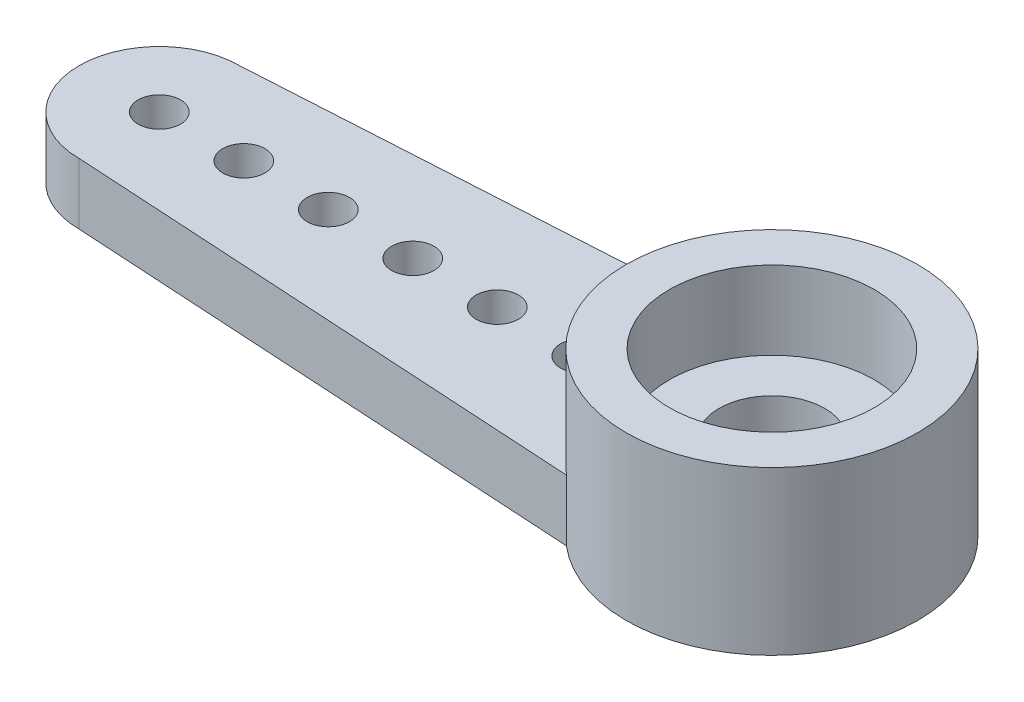
ISO-10303-21;
HEADER;
FILE_DESCRIPTION(('STEP AP214'),'2;1');
FILE_NAME('part.step','',(''),(''),'','','');
FILE_SCHEMA(('AUTOMOTIVE_DESIGN { 1 0 10303 214 1 1 1 1 }'));
ENDSEC;
DATA;
#1=APPLICATION_CONTEXT('core data for automotive mechanical design processes');
#2=APPLICATION_PROTOCOL_DEFINITION('international standard','automotive_design',2000,#1);
#3=PRODUCT_CONTEXT('',#1,'mechanical');
#4=PRODUCT('Part','Part','',(#3));
#5=PRODUCT_RELATED_PRODUCT_CATEGORY('part','',(#4));
#6=PRODUCT_DEFINITION_FORMATION('','',#4);
#7=PRODUCT_DEFINITION_CONTEXT('part definition',#1,'design');
#8=PRODUCT_DEFINITION('design','',#6,#7);
#9=PRODUCT_DEFINITION_SHAPE('','',#8);
#10=(LENGTH_UNIT() NAMED_UNIT(*) SI_UNIT(.MILLI.,.METRE.));
#11=(NAMED_UNIT(*) PLANE_ANGLE_UNIT() SI_UNIT($,.RADIAN.));
#12=(NAMED_UNIT(*) SI_UNIT($,.STERADIAN.) SOLID_ANGLE_UNIT());
#13=UNCERTAINTY_MEASURE_WITH_UNIT(LENGTH_MEASURE(1.E-05),#10,'distance_accuracy_value','');
#14=(GEOMETRIC_REPRESENTATION_CONTEXT(3) GLOBAL_UNCERTAINTY_ASSIGNED_CONTEXT((#13)) GLOBAL_UNIT_ASSIGNED_CONTEXT((#10,
#11,#12)) REPRESENTATION_CONTEXT('',''));
#15=CARTESIAN_POINT('',(0.,0.,0.));
#16=DIRECTION('',(0.,0.,1.));
#17=DIRECTION('',(1.,0.,0.));
#18=AXIS2_PLACEMENT_3D('',#15,#16,#17);
#19=CARTESIAN_POINT('',(0.,3.85,0.));
#20=DIRECTION('',(0.,-1.,0.));
#21=DIRECTION('',(0.,0.,-1.));
#22=AXIS2_PLACEMENT_3D('',#19,#20,#21);
#23=CYLINDRICAL_SURFACE('',#22,2.425);
#24=CARTESIAN_POINT('',(0.,3.85,0.));
#25=DIRECTION('',(0.,1.,0.));
#26=DIRECTION('',(0.,0.,1.));
#27=AXIS2_PLACEMENT_3D('',#24,#25,#26);
#28=CIRCLE('',#27,2.425);
#29=CARTESIAN_POINT('',(0.,3.85,-2.425));
#30=VERTEX_POINT('',#29);
#31=EDGE_CURVE('E124',#30,#30,#28,.T.);
#32=CARTESIAN_POINT('',(0.,2.,0.));
#33=DIRECTION('',(0.,-1.,0.));
#34=DIRECTION('',(0.,0.,-1.));
#35=AXIS2_PLACEMENT_3D('',#32,#33,#34);
#36=CIRCLE('',#35,2.425);
#37=CARTESIAN_POINT('',(0.,2.,-2.425));
#38=VERTEX_POINT('',#37);
#39=EDGE_CURVE('E118',#38,#38,#36,.T.);
#40=CARTESIAN_POINT('',(0.,3.85,-2.425));
#41=CARTESIAN_POINT('',(0.,3.83072916666667,-2.425));
#42=CARTESIAN_POINT('',(0.,3.81145833333333,-2.425));
#43=CARTESIAN_POINT('',(0.,3.77291666666667,-2.425));
#44=CARTESIAN_POINT('',(0.,3.75364583333333,-2.425));
#45=CARTESIAN_POINT('',(0.,3.71510416666667,-2.425));
#46=CARTESIAN_POINT('',(0.,3.69583333333333,-2.425));
#47=CARTESIAN_POINT('',(0.,3.65729166666667,-2.425));
#48=CARTESIAN_POINT('',(0.,3.63802083333333,-2.425));
#49=CARTESIAN_POINT('',(0.,3.59947916666667,-2.425));
#50=CARTESIAN_POINT('',(0.,3.58020833333333,-2.425));
#51=CARTESIAN_POINT('',(0.,3.54166666666667,-2.425));
#52=CARTESIAN_POINT('',(0.,3.52239583333333,-2.425));
#53=CARTESIAN_POINT('',(0.,3.48385416666667,-2.425));
#54=CARTESIAN_POINT('',(0.,3.46458333333333,-2.425));
#55=CARTESIAN_POINT('',(0.,3.42604166666667,-2.425));
#56=CARTESIAN_POINT('',(0.,3.40677083333333,-2.425));
#57=CARTESIAN_POINT('',(0.,3.36822916666667,-2.425));
#58=CARTESIAN_POINT('',(0.,3.34895833333333,-2.425));
#59=CARTESIAN_POINT('',(0.,3.31041666666667,-2.425));
#60=CARTESIAN_POINT('',(0.,3.29114583333333,-2.425));
#61=CARTESIAN_POINT('',(0.,3.25260416666667,-2.425));
#62=CARTESIAN_POINT('',(0.,3.23333333333333,-2.425));
#63=CARTESIAN_POINT('',(0.,3.19479166666667,-2.425));
#64=CARTESIAN_POINT('',(0.,3.17552083333333,-2.425));
#65=CARTESIAN_POINT('',(0.,3.13697916666667,-2.425));
#66=CARTESIAN_POINT('',(0.,3.11770833333333,-2.425));
#67=CARTESIAN_POINT('',(0.,3.07916666666667,-2.425));
#68=CARTESIAN_POINT('',(0.,3.05989583333333,-2.425));
#69=CARTESIAN_POINT('',(0.,3.02135416666667,-2.425));
#70=CARTESIAN_POINT('',(0.,3.00208333333333,-2.425));
#71=CARTESIAN_POINT('',(0.,2.96354166666667,-2.425));
#72=CARTESIAN_POINT('',(0.,2.94427083333333,-2.425));
#73=CARTESIAN_POINT('',(0.,2.90572916666667,-2.425));
#74=CARTESIAN_POINT('',(0.,2.88645833333333,-2.425));
#75=CARTESIAN_POINT('',(0.,2.84791666666667,-2.425));
#76=CARTESIAN_POINT('',(0.,2.82864583333333,-2.425));
#77=CARTESIAN_POINT('',(0.,2.79010416666667,-2.425));
#78=CARTESIAN_POINT('',(0.,2.77083333333333,-2.425));
#79=CARTESIAN_POINT('',(0.,2.73229166666667,-2.425));
#80=CARTESIAN_POINT('',(0.,2.71302083333333,-2.425));
#81=CARTESIAN_POINT('',(0.,2.67447916666667,-2.425));
#82=CARTESIAN_POINT('',(0.,2.65520833333333,-2.425));
#83=CARTESIAN_POINT('',(0.,2.61666666666667,-2.425));
#84=CARTESIAN_POINT('',(0.,2.59739583333333,-2.425));
#85=CARTESIAN_POINT('',(0.,2.55885416666667,-2.425));
#86=CARTESIAN_POINT('',(0.,2.53958333333333,-2.425));
#87=CARTESIAN_POINT('',(0.,2.50104166666667,-2.425));
#88=CARTESIAN_POINT('',(0.,2.48177083333333,-2.425));
#89=CARTESIAN_POINT('',(0.,2.44322916666667,-2.425));
#90=CARTESIAN_POINT('',(0.,2.42395833333333,-2.425));
#91=CARTESIAN_POINT('',(0.,2.38541666666667,-2.425));
#92=CARTESIAN_POINT('',(0.,2.36614583333333,-2.425));
#93=CARTESIAN_POINT('',(0.,2.32760416666667,-2.425));
#94=CARTESIAN_POINT('',(0.,2.30833333333333,-2.425));
#95=CARTESIAN_POINT('',(0.,2.26979166666667,-2.425));
#96=CARTESIAN_POINT('',(0.,2.25052083333333,-2.425));
#97=CARTESIAN_POINT('',(0.,2.21197916666667,-2.425));
#98=CARTESIAN_POINT('',(0.,2.19270833333333,-2.425));
#99=CARTESIAN_POINT('',(0.,2.15416666666667,-2.425));
#100=CARTESIAN_POINT('',(0.,2.13489583333333,-2.425));
#101=CARTESIAN_POINT('',(0.,2.09635416666667,-2.425));
#102=CARTESIAN_POINT('',(0.,2.07708333333333,-2.425));
#103=CARTESIAN_POINT('',(0.,2.03854166666667,-2.425));
#104=CARTESIAN_POINT('',(0.,2.01927083333333,-2.425));
#105=CARTESIAN_POINT('',(0.,2.,-2.425));
#106=B_SPLINE_CURVE_WITH_KNOTS('',3,(#40,#41,#42,#43,#44,#45,#46,#47,#48,#49,#50,#51,#52,#53,
#54,#55,#56,#57,#58,#59,#60,#61,#62,#63,#64,#65,#66,#67,#68,#69,#70,#71,#72,#73,#74,#75,#76,#77,
#78,#79,#80,#81,#82,#83,#84,#85,#86,#87,#88,#89,#90,#91,#92,#93,#94,#95,#96,#97,#98,#99,#100,
#101,#102,#103,#104,#105),.UNSPECIFIED.,.F.,.F.,(4,2,2,2,2,2,2,2,2,2,2,2,2,2,2,2,2,2,2,2,2,2,2,
2,2,2,2,2,2,2,2,2,4),(0.,0.0578125000000001,0.115625,0.1734375,0.23125,0.2890625,0.346875,
0.4046875,0.4625,0.5203125,0.578125,0.6359375,0.69375,0.7515625,0.809375,0.8671875,0.925,
0.9828125,1.040625,1.0984375,1.15625,1.2140625,1.271875,1.3296875,1.3875,1.4453125,1.503125,
1.5609375,1.61875,1.6765625,1.734375,1.7921875,1.85),.UNSPECIFIED.);
#107=EDGE_CURVE('BSEAM35',#30,#38,#106,.T.);
#108=ORIENTED_EDGE('',*,*,#31,.T.);
#109=ORIENTED_EDGE('',*,*,#39,.T.);
#110=ORIENTED_EDGE('',*,*,#107,.T.);
#111=ORIENTED_EDGE('',*,*,#107,.F.);
#112=EDGE_LOOP('',(#108,#110,#109,#111));
#113=FACE_BOUND('',#112,.T.);
#114=ADVANCED_FACE('F35',(#113),#23,.F.);
#115=CARTESIAN_POINT('',(0.,3.85,0.));
#116=DIRECTION('',(0.,1.,0.));
#117=DIRECTION('',(0.,0.,1.));
#118=AXIS2_PLACEMENT_3D('',#115,#116,#117);
#119=PLANE('',#118);
#120=CARTESIAN_POINT('',(0.,3.85,0.));
#121=DIRECTION('',(0.,1.,0.));
#122=DIRECTION('',(0.,0.,1.));
#123=AXIS2_PLACEMENT_3D('',#120,#121,#122);
#124=CIRCLE('',#123,3.45);
#125=CARTESIAN_POINT('',(0.,3.85,3.45));
#126=VERTEX_POINT('',#125);
#127=EDGE_CURVE('E43',#126,#126,#124,.T.);
#128=ORIENTED_EDGE('',*,*,#127,.T.);
#129=EDGE_LOOP('',(#128));
#130=FACE_BOUND('',#129,.T.);
#131=ORIENTED_EDGE('',*,*,#31,.F.);
#132=EDGE_LOOP('',(#131));
#133=FACE_BOUND('',#132,.T.);
#134=ADVANCED_FACE('F148',(#130,#133),#119,.T.);
#135=CARTESIAN_POINT('',(0.,0.,0.));
#136=DIRECTION('',(0.,1.,0.));
#137=DIRECTION('',(0.,0.,1.));
#138=AXIS2_PLACEMENT_3D('',#135,#136,#137);
#139=PLANE('',#138);
#140=CARTESIAN_POINT('',(0.,0.,0.));
#141=DIRECTION('',(0.,1.,0.));
#142=DIRECTION('',(0.,0.,1.));
#143=AXIS2_PLACEMENT_3D('',#140,#141,#142);
#144=CIRCLE('',#143,3.45);
#145=CARTESIAN_POINT('',(-2.23872173348989,0.,2.625));
#146=VERTEX_POINT('',#145);
#147=CARTESIAN_POINT('',(-2.23872173348989,0.,-2.625));
#148=VERTEX_POINT('',#147);
#149=EDGE_CURVE('E127',#146,#148,#144,.T.);
#150=ORIENTED_EDGE('',*,*,#149,.F.);
#151=DIRECTION('',(-0.998256437443181,0.,-0.05902613915248));
#152=VECTOR('',#151,1.);
#153=CARTESIAN_POINT('',(-14.5,0.,1.9));
#154=LINE('',#153,#152);
#155=CARTESIAN_POINT('',(-14.5,0.,1.9));
#156=VERTEX_POINT('',#155);
#157=EDGE_CURVE('E96',#146,#156,#154,.T.);
#158=ORIENTED_EDGE('',*,*,#157,.T.);
#159=CARTESIAN_POINT('',(-14.5,0.,0.));
#160=DIRECTION('',(0.,-1.,0.));
#161=DIRECTION('',(0.,0.,-1.));
#162=AXIS2_PLACEMENT_3D('',#159,#160,#161);
#163=CIRCLE('',#162,1.9);
#164=CARTESIAN_POINT('',(-14.5,0.,-1.9));
#165=VERTEX_POINT('',#164);
#166=EDGE_CURVE('E106',#156,#165,#163,.T.);
#167=ORIENTED_EDGE('',*,*,#166,.T.);
#168=DIRECTION('',(0.998256437443181,0.,-0.0590261391524801));
#169=VECTOR('',#168,1.);
#170=CARTESIAN_POINT('',(-14.5,0.,-1.9));
#171=LINE('',#170,#169);
#172=EDGE_CURVE('E80',#165,#148,#171,.T.);
#173=ORIENTED_EDGE('',*,*,#172,.T.);
#174=EDGE_LOOP('',(#150,#158,#167,#173));
#175=FACE_BOUND('',#174,.T.);
#176=CARTESIAN_POINT('',(0.,0.,0.));
#177=DIRECTION('',(0.,1.,0.));
#178=DIRECTION('',(0.,0.,1.));
#179=AXIS2_PLACEMENT_3D('',#176,#177,#178);
#180=CIRCLE('',#179,2.425);
#181=CARTESIAN_POINT('',(0.,0.,-2.425));
#182=VERTEX_POINT('',#181);
#183=EDGE_CURVE('E123',#182,#182,#180,.T.);
#184=ORIENTED_EDGE('',*,*,#183,.T.);
#185=EDGE_LOOP('',(#184));
#186=FACE_BOUND('',#185,.T.);
#187=CARTESIAN_POINT('',(-4.5,0.,0.));
#188=DIRECTION('',(0.,-1.,0.));
#189=DIRECTION('',(0.,0.,-1.));
#190=AXIS2_PLACEMENT_3D('',#187,#188,#189);
#191=CIRCLE('',#190,0.500000000000001);
#192=CARTESIAN_POINT('',(-4.5,0.,-0.500000000000003));
#193=VERTEX_POINT('',#192);
#194=EDGE_CURVE('E178',#193,#193,#191,.T.);
#195=ORIENTED_EDGE('',*,*,#194,.F.);
#196=EDGE_LOOP('',(#195));
#197=FACE_BOUND('',#196,.T.);
#198=CARTESIAN_POINT('',(-6.5,0.,0.));
#199=DIRECTION('',(0.,-1.,0.));
#200=DIRECTION('',(0.,0.,-1.));
#201=AXIS2_PLACEMENT_3D('',#198,#199,#200);
#202=CIRCLE('',#201,0.500000000000001);
#203=CARTESIAN_POINT('',(-6.5,0.,-0.500000000000003));
#204=VERTEX_POINT('',#203);
#205=EDGE_CURVE('E182',#204,#204,#202,.T.);
#206=ORIENTED_EDGE('',*,*,#205,.F.);
#207=EDGE_LOOP('',(#206));
#208=FACE_BOUND('',#207,.T.);
#209=CARTESIAN_POINT('',(-8.5,0.,0.));
#210=DIRECTION('',(0.,-1.,0.));
#211=DIRECTION('',(0.,0.,-1.));
#212=AXIS2_PLACEMENT_3D('',#209,#210,#211);
#213=CIRCLE('',#212,0.500000000000001);
#214=CARTESIAN_POINT('',(-8.5,0.,-0.500000000000003));
#215=VERTEX_POINT('',#214);
#216=EDGE_CURVE('E186',#215,#215,#213,.T.);
#217=ORIENTED_EDGE('',*,*,#216,.F.);
#218=EDGE_LOOP('',(#217));
#219=FACE_BOUND('',#218,.T.);
#220=CARTESIAN_POINT('',(-10.5,0.,0.));
#221=DIRECTION('',(0.,-1.,0.));
#222=DIRECTION('',(0.,0.,-1.));
#223=AXIS2_PLACEMENT_3D('',#220,#221,#222);
#224=CIRCLE('',#223,0.500000000000001);
#225=CARTESIAN_POINT('',(-10.5,0.,-0.500000000000003));
#226=VERTEX_POINT('',#225);
#227=EDGE_CURVE('E190',#226,#226,#224,.T.);
#228=ORIENTED_EDGE('',*,*,#227,.F.);
#229=EDGE_LOOP('',(#228));
#230=FACE_BOUND('',#229,.T.);
#231=CARTESIAN_POINT('',(-12.5,0.,0.));
#232=DIRECTION('',(0.,-1.,0.));
#233=DIRECTION('',(0.,0.,-1.));
#234=AXIS2_PLACEMENT_3D('',#231,#232,#233);
#235=CIRCLE('',#234,0.500000000000001);
#236=CARTESIAN_POINT('',(-12.5,0.,-0.500000000000003));
#237=VERTEX_POINT('',#236);
#238=EDGE_CURVE('E194',#237,#237,#235,.T.);
#239=ORIENTED_EDGE('',*,*,#238,.F.);
#240=EDGE_LOOP('',(#239));
#241=FACE_BOUND('',#240,.T.);
#242=CARTESIAN_POINT('',(-14.5,0.,0.));
#243=DIRECTION('',(0.,-1.,0.));
#244=DIRECTION('',(0.,0.,-1.));
#245=AXIS2_PLACEMENT_3D('',#242,#243,#244);
#246=CIRCLE('',#245,0.500000000000001);
#247=CARTESIAN_POINT('',(-14.5,0.,-0.500000000000003));
#248=VERTEX_POINT('',#247);
#249=EDGE_CURVE('E101',#248,#248,#246,.T.);
#250=ORIENTED_EDGE('',*,*,#249,.F.);
#251=EDGE_LOOP('',(#250));
#252=FACE_BOUND('',#251,.T.);
#253=ADVANCED_FACE('F133',(#175,#186,#197,#208,#219,#230,#241,#252),#139,.F.);
#254=CARTESIAN_POINT('',(0.,3.85,0.));
#255=DIRECTION('',(0.,-1.,0.));
#256=DIRECTION('',(0.,0.,-1.));
#257=AXIS2_PLACEMENT_3D('',#254,#255,#256);
#258=CYLINDRICAL_SURFACE('',#257,3.45);
#259=ORIENTED_EDGE('',*,*,#127,.F.);
#260=EDGE_LOOP('',(#259));
#261=FACE_BOUND('',#260,.T.);
#262=CARTESIAN_POINT('',(0.,1.45,0.));
#263=DIRECTION('',(0.,1.,0.));
#264=DIRECTION('',(0.,0.,-1.));
#265=AXIS2_PLACEMENT_3D('',#262,#263,#264);
#266=CIRCLE('',#265,3.45);
#267=CARTESIAN_POINT('',(-2.2387217334899,1.45,-2.625));
#268=VERTEX_POINT('',#267);
#269=CARTESIAN_POINT('',(-2.2387217334899,1.45,2.625));
#270=VERTEX_POINT('',#269);
#271=EDGE_CURVE('E54',#268,#270,#266,.T.);
#272=ORIENTED_EDGE('',*,*,#271,.T.);
#273=DIRECTION('',(0.,-1.,0.));
#274=VECTOR('',#273,1.);
#275=CARTESIAN_POINT('',(-2.23872173348989,1.45,2.625));
#276=LINE('',#275,#274);
#277=EDGE_CURVE('E112',#270,#146,#276,.T.);
#278=ORIENTED_EDGE('',*,*,#277,.T.);
#279=ORIENTED_EDGE('',*,*,#149,.T.);
#280=DIRECTION('',(0.,-1.,0.));
#281=VECTOR('',#280,1.);
#282=CARTESIAN_POINT('',(-2.2387217334899,1.45,-2.625));
#283=LINE('',#282,#281);
#284=EDGE_CURVE('E50',#268,#148,#283,.T.);
#285=ORIENTED_EDGE('',*,*,#284,.F.);
#286=EDGE_LOOP('',(#272,#278,#279,#285));
#287=FACE_BOUND('',#286,.T.);
#288=ADVANCED_FACE('F37',(#261,#287),#258,.T.);
#289=CARTESIAN_POINT('',(0.,1.,0.));
#290=DIRECTION('',(0.,-1.,0.));
#291=DIRECTION('',(0.,0.,-1.));
#292=AXIS2_PLACEMENT_3D('',#289,#290,#291);
#293=CIRCLE('',#292,2.425);
#294=CARTESIAN_POINT('',(0.,1.,-2.425));
#295=VERTEX_POINT('',#294);
#296=EDGE_CURVE('E11',#295,#295,#293,.T.);
#297=CARTESIAN_POINT('',(0.,1.,-2.425));
#298=CARTESIAN_POINT('',(0.,0.989583333333334,-2.425));
#299=CARTESIAN_POINT('',(0.,0.979166666666667,-2.425));
#300=CARTESIAN_POINT('',(0.,0.958333333333334,-2.425));
#301=CARTESIAN_POINT('',(0.,0.947916666666667,-2.425));
#302=CARTESIAN_POINT('',(0.,0.927083333333334,-2.425));
#303=CARTESIAN_POINT('',(0.,0.916666666666667,-2.425));
#304=CARTESIAN_POINT('',(0.,0.895833333333334,-2.425));
#305=CARTESIAN_POINT('',(0.,0.885416666666667,-2.425));
#306=CARTESIAN_POINT('',(0.,0.864583333333334,-2.425));
#307=CARTESIAN_POINT('',(0.,0.854166666666667,-2.425));
#308=CARTESIAN_POINT('',(0.,0.833333333333334,-2.425));
#309=CARTESIAN_POINT('',(0.,0.822916666666667,-2.425));
#310=CARTESIAN_POINT('',(0.,0.802083333333334,-2.425));
#311=CARTESIAN_POINT('',(0.,0.791666666666667,-2.425));
#312=CARTESIAN_POINT('',(0.,0.770833333333334,-2.425));
#313=CARTESIAN_POINT('',(0.,0.760416666666667,-2.425));
#314=CARTESIAN_POINT('',(0.,0.739583333333333,-2.425));
#315=CARTESIAN_POINT('',(0.,0.729166666666667,-2.425));
#316=CARTESIAN_POINT('',(0.,0.708333333333333,-2.425));
#317=CARTESIAN_POINT('',(0.,0.697916666666667,-2.425));
#318=CARTESIAN_POINT('',(0.,0.677083333333333,-2.425));
#319=CARTESIAN_POINT('',(0.,0.666666666666667,-2.425));
#320=CARTESIAN_POINT('',(0.,0.645833333333333,-2.425));
#321=CARTESIAN_POINT('',(0.,0.635416666666667,-2.425));
#322=CARTESIAN_POINT('',(0.,0.614583333333333,-2.425));
#323=CARTESIAN_POINT('',(0.,0.604166666666667,-2.425));
#324=CARTESIAN_POINT('',(0.,0.583333333333333,-2.425));
#325=CARTESIAN_POINT('',(0.,0.572916666666667,-2.425));
#326=CARTESIAN_POINT('',(0.,0.552083333333333,-2.425));
#327=CARTESIAN_POINT('',(0.,0.541666666666667,-2.425));
#328=CARTESIAN_POINT('',(0.,0.520833333333333,-2.425));
#329=CARTESIAN_POINT('',(0.,0.510416666666667,-2.425));
#330=CARTESIAN_POINT('',(0.,0.489583333333333,-2.425));
#331=CARTESIAN_POINT('',(0.,0.479166666666667,-2.425));
#332=CARTESIAN_POINT('',(0.,0.458333333333333,-2.425));
#333=CARTESIAN_POINT('',(0.,0.447916666666667,-2.425));
#334=CARTESIAN_POINT('',(0.,0.427083333333333,-2.425));
#335=CARTESIAN_POINT('',(0.,0.416666666666667,-2.425));
#336=CARTESIAN_POINT('',(0.,0.395833333333333,-2.425));
#337=CARTESIAN_POINT('',(0.,0.385416666666667,-2.425));
#338=CARTESIAN_POINT('',(0.,0.364583333333333,-2.425));
#339=CARTESIAN_POINT('',(0.,0.354166666666667,-2.425));
#340=CARTESIAN_POINT('',(0.,0.333333333333333,-2.425));
#341=CARTESIAN_POINT('',(0.,0.322916666666667,-2.425));
#342=CARTESIAN_POINT('',(0.,0.302083333333333,-2.425));
#343=CARTESIAN_POINT('',(0.,0.291666666666666,-2.425));
#344=CARTESIAN_POINT('',(0.,0.270833333333333,-2.425));
#345=CARTESIAN_POINT('',(0.,0.260416666666666,-2.425));
#346=CARTESIAN_POINT('',(0.,0.239583333333333,-2.425));
#347=CARTESIAN_POINT('',(0.,0.229166666666666,-2.425));
#348=CARTESIAN_POINT('',(0.,0.208333333333333,-2.425));
#349=CARTESIAN_POINT('',(0.,0.197916666666666,-2.425));
#350=CARTESIAN_POINT('',(0.,0.177083333333333,-2.425));
#351=CARTESIAN_POINT('',(0.,0.166666666666666,-2.425));
#352=CARTESIAN_POINT('',(0.,0.145833333333333,-2.425));
#353=CARTESIAN_POINT('',(0.,0.135416666666666,-2.425));
#354=CARTESIAN_POINT('',(0.,0.114583333333333,-2.425));
#355=CARTESIAN_POINT('',(0.,0.104166666666666,-2.425));
#356=CARTESIAN_POINT('',(0.,0.083333333333333,-2.425));
#357=CARTESIAN_POINT('',(0.,0.0729166666666663,-2.425));
#358=CARTESIAN_POINT('',(0.,0.0520833333333329,-2.425));
#359=CARTESIAN_POINT('',(0.,0.0416666666666663,-2.425));
#360=CARTESIAN_POINT('',(0.,0.0208333333333329,-2.425));
#361=CARTESIAN_POINT('',(0.,0.0104166666666662,-2.425));
#362=CARTESIAN_POINT('',(0.,0.,-2.425));
#363=B_SPLINE_CURVE_WITH_KNOTS('',3,(#297,#298,#299,#300,#301,#302,#303,#304,#305,#306,#307,
#308,#309,#310,#311,#312,#313,#314,#315,#316,#317,#318,#319,#320,#321,#322,#323,#324,#325,#326,
#327,#328,#329,#330,#331,#332,#333,#334,#335,#336,#337,#338,#339,#340,#341,#342,#343,#344,#345,
#346,#347,#348,#349,#350,#351,#352,#353,#354,#355,#356,#357,#358,#359,#360,#361,#362),
.UNSPECIFIED.,.F.,.F.,(4,2,2,2,2,2,2,2,2,2,2,2,2,2,2,2,2,2,2,2,2,2,2,2,2,2,2,2,2,2,2,2,4),(0.,
0.03125,0.0625000000000001,0.0937500000000001,0.125,0.15625,0.1875,0.21875,0.25,0.28125,0.3125,
0.34375,0.375,0.40625,0.4375,0.46875,0.5,0.53125,0.5625,0.593750000000001,0.625000000000001,
0.656250000000001,0.687500000000001,0.718750000000001,0.750000000000001,0.781250000000001,
0.812500000000001,0.843750000000001,0.875000000000001,0.906250000000001,0.937500000000001,
0.968750000000001,1.),.UNSPECIFIED.);
#364=EDGE_CURVE('BSEAM151',#295,#182,#363,.T.);
#365=ORIENTED_EDGE('',*,*,#296,.F.);
#366=ORIENTED_EDGE('',*,*,#183,.F.);
#367=ORIENTED_EDGE('',*,*,#364,.T.);
#368=ORIENTED_EDGE('',*,*,#364,.F.);
#369=EDGE_LOOP('',(#365,#367,#366,#368));
#370=FACE_BOUND('',#369,.T.);
#371=ADVANCED_FACE('F151',(#370),#23,.F.);
#372=CARTESIAN_POINT('',(0.,2.,0.));
#373=DIRECTION('',(0.,-1.,0.));
#374=DIRECTION('',(0.,0.,-1.));
#375=AXIS2_PLACEMENT_3D('',#372,#373,#374);
#376=PLANE('',#375);
#377=CARTESIAN_POINT('',(0.,2.,0.));
#378=DIRECTION('',(0.,-1.,0.));
#379=DIRECTION('',(0.,0.,-1.));
#380=AXIS2_PLACEMENT_3D('',#377,#378,#379);
#381=CIRCLE('',#380,1.25);
#382=CARTESIAN_POINT('',(0.,2.,-1.25));
#383=VERTEX_POINT('',#382);
#384=EDGE_CURVE('E115',#383,#383,#381,.T.);
#385=ORIENTED_EDGE('',*,*,#384,.T.);
#386=EDGE_LOOP('',(#385));
#387=FACE_BOUND('',#386,.T.);
#388=ORIENTED_EDGE('',*,*,#39,.F.);
#389=EDGE_LOOP('',(#388));
#390=FACE_BOUND('',#389,.T.);
#391=ADVANCED_FACE('F160',(#387,#390),#376,.F.);
#392=CARTESIAN_POINT('',(0.,1.,0.));
#393=DIRECTION('',(0.,-1.,0.));
#394=DIRECTION('',(0.,0.,-1.));
#395=AXIS2_PLACEMENT_3D('',#392,#393,#394);
#396=PLANE('',#395);
#397=CARTESIAN_POINT('',(0.,1.,0.));
#398=DIRECTION('',(0.,-1.,0.));
#399=DIRECTION('',(0.,0.,-1.));
#400=AXIS2_PLACEMENT_3D('',#397,#398,#399);
#401=CIRCLE('',#400,1.25);
#402=CARTESIAN_POINT('',(0.,1.,-1.25));
#403=VERTEX_POINT('',#402);
#404=EDGE_CURVE('E111',#403,#403,#401,.T.);
#405=ORIENTED_EDGE('',*,*,#404,.F.);
#406=EDGE_LOOP('',(#405));
#407=FACE_BOUND('',#406,.T.);
#408=ORIENTED_EDGE('',*,*,#296,.T.);
#409=EDGE_LOOP('',(#408));
#410=FACE_BOUND('',#409,.T.);
#411=ADVANCED_FACE('F166',(#407,#410),#396,.T.);
#412=CARTESIAN_POINT('',(0.,2.,0.));
#413=DIRECTION('',(0.,-1.,0.));
#414=DIRECTION('',(0.,0.,-1.));
#415=AXIS2_PLACEMENT_3D('',#412,#413,#414);
#416=CYLINDRICAL_SURFACE('',#415,1.25);
#417=ORIENTED_EDGE('',*,*,#384,.F.);
#418=EDGE_LOOP('',(#417));
#419=FACE_BOUND('',#418,.T.);
#420=ORIENTED_EDGE('',*,*,#404,.T.);
#421=EDGE_LOOP('',(#420));
#422=FACE_BOUND('',#421,.T.);
#423=ADVANCED_FACE('F144',(#419,#422),#416,.F.);
#424=CARTESIAN_POINT('',(-14.5,1.45,0.));
#425=DIRECTION('',(0.,-1.,0.));
#426=DIRECTION('',(0.,0.,-1.));
#427=AXIS2_PLACEMENT_3D('',#424,#425,#426);
#428=CYLINDRICAL_SURFACE('',#427,1.9);
#429=ORIENTED_EDGE('',*,*,#166,.F.);
#430=DIRECTION('',(0.,-1.,0.));
#431=VECTOR('',#430,1.);
#432=CARTESIAN_POINT('',(-14.5,1.45,1.9));
#433=LINE('',#432,#431);
#434=CARTESIAN_POINT('',(-14.5,1.45,1.9));
#435=VERTEX_POINT('',#434);
#436=EDGE_CURVE('E95',#435,#156,#433,.T.);
#437=ORIENTED_EDGE('',*,*,#436,.F.);
#438=CARTESIAN_POINT('',(-14.5,1.45,0.));
#439=DIRECTION('',(0.,-1.,0.));
#440=DIRECTION('',(0.,0.,-1.));
#441=AXIS2_PLACEMENT_3D('',#438,#439,#440);
#442=CIRCLE('',#441,1.9);
#443=CARTESIAN_POINT('',(-14.5,1.45,-1.9));
#444=VERTEX_POINT('',#443);
#445=EDGE_CURVE('E91',#435,#444,#442,.T.);
#446=ORIENTED_EDGE('',*,*,#445,.T.);
#447=DIRECTION('',(0.,-1.,0.));
#448=VECTOR('',#447,1.);
#449=CARTESIAN_POINT('',(-14.5,1.45,-1.9));
#450=LINE('',#449,#448);
#451=EDGE_CURVE('E75',#444,#165,#450,.T.);
#452=ORIENTED_EDGE('',*,*,#451,.T.);
#453=EDGE_LOOP('',(#429,#437,#446,#452));
#454=FACE_BOUND('',#453,.T.);
#455=ADVANCED_FACE('F94',(#454),#428,.T.);
#456=CARTESIAN_POINT('',(-14.5,1.45,1.9));
#457=DIRECTION('',(-0.05902613915248,0.,0.998256437443181));
#458=DIRECTION('',(0.998256437443181,0.,0.05902613915248));
#459=AXIS2_PLACEMENT_3D('',#456,#457,#458);
#460=PLANE('',#459);
#461=ORIENTED_EDGE('',*,*,#157,.F.);
#462=ORIENTED_EDGE('',*,*,#277,.F.);
#463=DIRECTION('',(-0.998256437443181,0.,-0.05902613915248));
#464=VECTOR('',#463,1.);
#465=CARTESIAN_POINT('',(-14.5,1.45,1.9));
#466=LINE('',#465,#464);
#467=EDGE_CURVE('E85',#270,#435,#466,.T.);
#468=ORIENTED_EDGE('',*,*,#467,.T.);
#469=ORIENTED_EDGE('',*,*,#436,.T.);
#470=EDGE_LOOP('',(#461,#462,#468,#469));
#471=FACE_BOUND('',#470,.T.);
#472=ADVANCED_FACE('F136',(#471),#460,.T.);
#473=CARTESIAN_POINT('',(-14.5,1.45,-1.9));
#474=DIRECTION('',(-0.0590261391524801,0.,-0.998256437443181));
#475=DIRECTION('',(-0.998256437443181,0.,0.0590261391524801));
#476=AXIS2_PLACEMENT_3D('',#473,#474,#475);
#477=PLANE('',#476);
#478=ORIENTED_EDGE('',*,*,#172,.F.);
#479=ORIENTED_EDGE('',*,*,#451,.F.);
#480=DIRECTION('',(0.998256437443181,0.,-0.0590261391524801));
#481=VECTOR('',#480,1.);
#482=CARTESIAN_POINT('',(-14.5,1.45,-1.9));
#483=LINE('',#482,#481);
#484=EDGE_CURVE('E78',#444,#268,#483,.T.);
#485=ORIENTED_EDGE('',*,*,#484,.T.);
#486=ORIENTED_EDGE('',*,*,#284,.T.);
#487=EDGE_LOOP('',(#478,#479,#485,#486));
#488=FACE_BOUND('',#487,.T.);
#489=ADVANCED_FACE('F77',(#488),#477,.T.);
#490=CARTESIAN_POINT('',(-14.5,1.45,0.));
#491=DIRECTION('',(0.,-1.,0.));
#492=DIRECTION('',(0.,0.,-1.));
#493=AXIS2_PLACEMENT_3D('',#490,#491,#492);
#494=PLANE('',#493);
#495=CARTESIAN_POINT('',(-4.5,1.45,0.));
#496=DIRECTION('',(0.,-1.,0.));
#497=DIRECTION('',(0.,0.,-1.));
#498=AXIS2_PLACEMENT_3D('',#495,#496,#497);
#499=CIRCLE('',#498,0.500000000000001);
#500=CARTESIAN_POINT('',(-4.5,1.45,-0.500000000000003));
#501=VERTEX_POINT('',#500);
#502=EDGE_CURVE('E216',#501,#501,#499,.T.);
#503=ORIENTED_EDGE('',*,*,#502,.T.);
#504=EDGE_LOOP('',(#503));
#505=FACE_BOUND('',#504,.T.);
#506=CARTESIAN_POINT('',(-6.5,1.45,0.));
#507=DIRECTION('',(0.,-1.,0.));
#508=DIRECTION('',(0.,0.,-1.));
#509=AXIS2_PLACEMENT_3D('',#506,#507,#508);
#510=CIRCLE('',#509,0.500000000000001);
#511=CARTESIAN_POINT('',(-6.5,1.45,-0.500000000000003));
#512=VERTEX_POINT('',#511);
#513=EDGE_CURVE('E212',#512,#512,#510,.T.);
#514=ORIENTED_EDGE('',*,*,#513,.T.);
#515=EDGE_LOOP('',(#514));
#516=FACE_BOUND('',#515,.T.);
#517=CARTESIAN_POINT('',(-8.5,1.45,0.));
#518=DIRECTION('',(0.,-1.,0.));
#519=DIRECTION('',(0.,0.,-1.));
#520=AXIS2_PLACEMENT_3D('',#517,#518,#519);
#521=CIRCLE('',#520,0.500000000000001);
#522=CARTESIAN_POINT('',(-8.5,1.45,-0.500000000000003));
#523=VERTEX_POINT('',#522);
#524=EDGE_CURVE('E208',#523,#523,#521,.T.);
#525=ORIENTED_EDGE('',*,*,#524,.T.);
#526=EDGE_LOOP('',(#525));
#527=FACE_BOUND('',#526,.T.);
#528=CARTESIAN_POINT('',(-10.5,1.45,0.));
#529=DIRECTION('',(0.,-1.,0.));
#530=DIRECTION('',(0.,0.,-1.));
#531=AXIS2_PLACEMENT_3D('',#528,#529,#530);
#532=CIRCLE('',#531,0.500000000000001);
#533=CARTESIAN_POINT('',(-10.5,1.45,-0.500000000000003));
#534=VERTEX_POINT('',#533);
#535=EDGE_CURVE('E204',#534,#534,#532,.T.);
#536=ORIENTED_EDGE('',*,*,#535,.T.);
#537=EDGE_LOOP('',(#536));
#538=FACE_BOUND('',#537,.T.);
#539=CARTESIAN_POINT('',(-12.5,1.45,0.));
#540=DIRECTION('',(0.,-1.,0.));
#541=DIRECTION('',(0.,0.,-1.));
#542=AXIS2_PLACEMENT_3D('',#539,#540,#541);
#543=CIRCLE('',#542,0.500000000000001);
#544=CARTESIAN_POINT('',(-12.5,1.45,-0.500000000000003));
#545=VERTEX_POINT('',#544);
#546=EDGE_CURVE('E198',#545,#545,#543,.T.);
#547=ORIENTED_EDGE('',*,*,#546,.T.);
#548=EDGE_LOOP('',(#547));
#549=FACE_BOUND('',#548,.T.);
#550=CARTESIAN_POINT('',(-14.5,1.45,0.));
#551=DIRECTION('',(0.,-1.,0.));
#552=DIRECTION('',(0.,0.,-1.));
#553=AXIS2_PLACEMENT_3D('',#550,#551,#552);
#554=CIRCLE('',#553,0.500000000000001);
#555=CARTESIAN_POINT('',(-14.5,1.45,-0.500000000000003));
#556=VERTEX_POINT('',#555);
#557=EDGE_CURVE('E108',#556,#556,#554,.T.);
#558=ORIENTED_EDGE('',*,*,#557,.T.);
#559=EDGE_LOOP('',(#558));
#560=FACE_BOUND('',#559,.T.);
#561=ORIENTED_EDGE('',*,*,#445,.F.);
#562=ORIENTED_EDGE('',*,*,#467,.F.);
#563=ORIENTED_EDGE('',*,*,#271,.F.);
#564=ORIENTED_EDGE('',*,*,#484,.F.);
#565=EDGE_LOOP('',(#561,#562,#563,#564));
#566=FACE_BOUND('',#565,.T.);
#567=ADVANCED_FACE('F89',(#505,#516,#527,#538,#549,#560,#566),#494,.F.);
#568=CARTESIAN_POINT('',(-14.5,1.45,0.));
#569=DIRECTION('',(0.,-1.,0.));
#570=DIRECTION('',(0.,0.,-1.));
#571=AXIS2_PLACEMENT_3D('',#568,#569,#570);
#572=CYLINDRICAL_SURFACE('',#571,0.500000000000001);
#573=ORIENTED_EDGE('',*,*,#557,.F.);
#574=EDGE_LOOP('',(#573));
#575=FACE_BOUND('',#574,.T.);
#576=ORIENTED_EDGE('',*,*,#249,.T.);
#577=EDGE_LOOP('',(#576));
#578=FACE_BOUND('',#577,.T.);
#579=ADVANCED_FACE('F247',(#575,#578),#572,.F.);
#580=CARTESIAN_POINT('',(-12.5,1.45,0.));
#581=DIRECTION('',(0.,-1.,0.));
#582=DIRECTION('',(0.,0.,-1.));
#583=AXIS2_PLACEMENT_3D('',#580,#581,#582);
#584=CYLINDRICAL_SURFACE('',#583,0.500000000000001);
#585=ORIENTED_EDGE('',*,*,#546,.F.);
#586=EDGE_LOOP('',(#585));
#587=FACE_BOUND('',#586,.T.);
#588=ORIENTED_EDGE('',*,*,#238,.T.);
#589=EDGE_LOOP('',(#588));
#590=FACE_BOUND('',#589,.T.);
#591=ADVANCED_FACE('F243',(#587,#590),#584,.F.);
#592=CARTESIAN_POINT('',(-10.5,1.45,0.));
#593=DIRECTION('',(0.,-1.,0.));
#594=DIRECTION('',(0.,0.,-1.));
#595=AXIS2_PLACEMENT_3D('',#592,#593,#594);
#596=CYLINDRICAL_SURFACE('',#595,0.500000000000001);
#597=ORIENTED_EDGE('',*,*,#535,.F.);
#598=EDGE_LOOP('',(#597));
#599=FACE_BOUND('',#598,.T.);
#600=ORIENTED_EDGE('',*,*,#227,.T.);
#601=EDGE_LOOP('',(#600));
#602=FACE_BOUND('',#601,.T.);
#603=ADVANCED_FACE('F239',(#599,#602),#596,.F.);
#604=CARTESIAN_POINT('',(-8.5,1.45,0.));
#605=DIRECTION('',(0.,-1.,0.));
#606=DIRECTION('',(0.,0.,-1.));
#607=AXIS2_PLACEMENT_3D('',#604,#605,#606);
#608=CYLINDRICAL_SURFACE('',#607,0.500000000000001);
#609=ORIENTED_EDGE('',*,*,#524,.F.);
#610=EDGE_LOOP('',(#609));
#611=FACE_BOUND('',#610,.T.);
#612=ORIENTED_EDGE('',*,*,#216,.T.);
#613=EDGE_LOOP('',(#612));
#614=FACE_BOUND('',#613,.T.);
#615=ADVANCED_FACE('F233',(#611,#614),#608,.F.);
#616=CARTESIAN_POINT('',(-6.5,1.45,0.));
#617=DIRECTION('',(0.,-1.,0.));
#618=DIRECTION('',(0.,0.,-1.));
#619=AXIS2_PLACEMENT_3D('',#616,#617,#618);
#620=CYLINDRICAL_SURFACE('',#619,0.500000000000001);
#621=ORIENTED_EDGE('',*,*,#513,.F.);
#622=EDGE_LOOP('',(#621));
#623=FACE_BOUND('',#622,.T.);
#624=ORIENTED_EDGE('',*,*,#205,.T.);
#625=EDGE_LOOP('',(#624));
#626=FACE_BOUND('',#625,.T.);
#627=ADVANCED_FACE('F228',(#623,#626),#620,.F.);
#628=CARTESIAN_POINT('',(-4.5,1.45,0.));
#629=DIRECTION('',(0.,-1.,0.));
#630=DIRECTION('',(0.,0.,-1.));
#631=AXIS2_PLACEMENT_3D('',#628,#629,#630);
#632=CYLINDRICAL_SURFACE('',#631,0.500000000000001);
#633=ORIENTED_EDGE('',*,*,#502,.F.);
#634=EDGE_LOOP('',(#633));
#635=FACE_BOUND('',#634,.T.);
#636=ORIENTED_EDGE('',*,*,#194,.T.);
#637=EDGE_LOOP('',(#636));
#638=FACE_BOUND('',#637,.T.);
#639=ADVANCED_FACE('F225',(#635,#638),#632,.F.);
#640=CLOSED_SHELL('',(#114,#134,#253,#288,#371,#391,#411,#423,#455,#472,#489,#567,#579,#591,
#603,#615,#627,#639));
#641=MANIFOLD_SOLID_BREP('B2',#640);
#642=ADVANCED_BREP_SHAPE_REPRESENTATION('',(#18,#641),#14);
#643=SHAPE_DEFINITION_REPRESENTATION(#9,#642);
ENDSEC;
END-ISO-10303-21;
